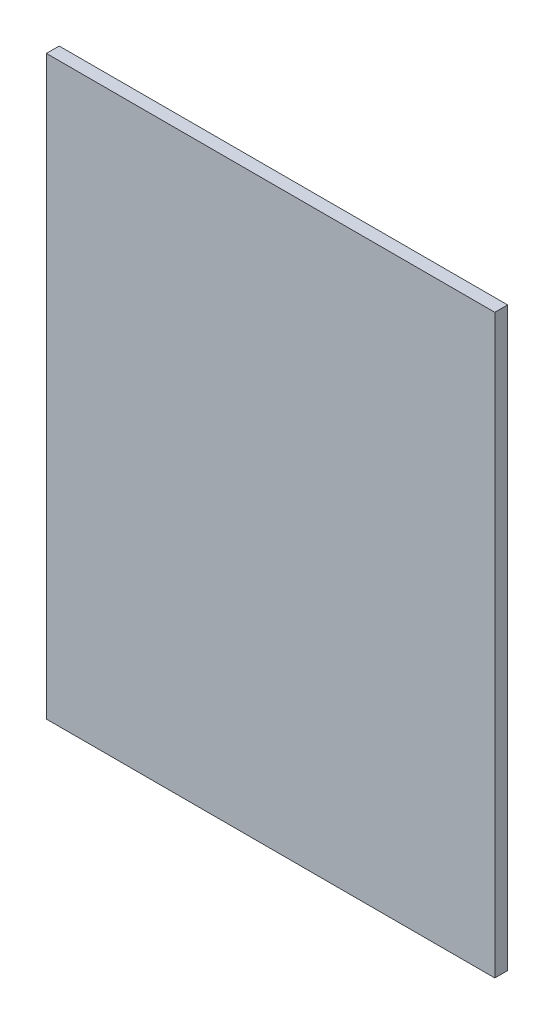
ISO-10303-21;
HEADER;
FILE_DESCRIPTION(('STEP AP214'),'2;1');
FILE_NAME('part.step','',(''),(''),'','','');
FILE_SCHEMA(('AUTOMOTIVE_DESIGN { 1 0 10303 214 1 1 1 1 }'));
ENDSEC;
DATA;
#1=APPLICATION_CONTEXT('core data for automotive mechanical design processes');
#2=APPLICATION_PROTOCOL_DEFINITION('international standard','automotive_design',2000,#1);
#3=PRODUCT_CONTEXT('',#1,'mechanical');
#4=PRODUCT('Part','Part','',(#3));
#5=PRODUCT_RELATED_PRODUCT_CATEGORY('part','',(#4));
#6=PRODUCT_DEFINITION_FORMATION('','',#4);
#7=PRODUCT_DEFINITION_CONTEXT('part definition',#1,'design');
#8=PRODUCT_DEFINITION('design','',#6,#7);
#9=PRODUCT_DEFINITION_SHAPE('','',#8);
#10=(LENGTH_UNIT() NAMED_UNIT(*) SI_UNIT(.MILLI.,.METRE.));
#11=(NAMED_UNIT(*) PLANE_ANGLE_UNIT() SI_UNIT($,.RADIAN.));
#12=(NAMED_UNIT(*) SI_UNIT($,.STERADIAN.) SOLID_ANGLE_UNIT());
#13=UNCERTAINTY_MEASURE_WITH_UNIT(LENGTH_MEASURE(1.E-05),#10,'distance_accuracy_value','');
#14=(GEOMETRIC_REPRESENTATION_CONTEXT(3) GLOBAL_UNCERTAINTY_ASSIGNED_CONTEXT((#13)) GLOBAL_UNIT_ASSIGNED_CONTEXT((#10,
#11,#12)) REPRESENTATION_CONTEXT('',''));
#15=CARTESIAN_POINT('',(0.,0.,0.));
#16=DIRECTION('',(0.,0.,1.));
#17=DIRECTION('',(1.,0.,0.));
#18=AXIS2_PLACEMENT_3D('',#15,#16,#17);
#19=CARTESIAN_POINT('',(70.,-90.,4.));
#20=DIRECTION('',(-1.,0.,0.));
#21=DIRECTION('',(0.,0.,1.));
#22=AXIS2_PLACEMENT_3D('',#19,#20,#21);
#23=PLANE('',#22);
#24=DIRECTION('',(0.,1.,0.));
#25=VECTOR('',#24,1.);
#26=CARTESIAN_POINT('',(70.,-90.,0.));
#27=LINE('',#26,#25);
#28=CARTESIAN_POINT('',(70.,-90.,0.));
#29=VERTEX_POINT('',#28);
#30=CARTESIAN_POINT('',(70.,90.,0.));
#31=VERTEX_POINT('',#30);
#32=EDGE_CURVE('E109',#29,#31,#27,.T.);
#33=ORIENTED_EDGE('',*,*,#32,.T.);
#34=DIRECTION('',(0.,0.,-1.));
#35=VECTOR('',#34,1.);
#36=CARTESIAN_POINT('',(70.,90.,4.));
#37=LINE('',#36,#35);
#38=CARTESIAN_POINT('',(70.,90.,4.));
#39=VERTEX_POINT('',#38);
#40=EDGE_CURVE('E11',#39,#31,#37,.T.);
#41=ORIENTED_EDGE('',*,*,#40,.F.);
#42=DIRECTION('',(0.,1.,0.));
#43=VECTOR('',#42,1.);
#44=CARTESIAN_POINT('',(70.,-90.,4.));
#45=LINE('',#44,#43);
#46=CARTESIAN_POINT('',(70.,-90.,4.));
#47=VERTEX_POINT('',#46);
#48=EDGE_CURVE('E93',#47,#39,#45,.T.);
#49=ORIENTED_EDGE('',*,*,#48,.F.);
#50=DIRECTION('',(0.,0.,-1.));
#51=VECTOR('',#50,1.);
#52=CARTESIAN_POINT('',(70.,-90.,4.));
#53=LINE('',#52,#51);
#54=EDGE_CURVE('E105',#47,#29,#53,.T.);
#55=ORIENTED_EDGE('',*,*,#54,.T.);
#56=EDGE_LOOP('',(#33,#41,#49,#55));
#57=FACE_BOUND('',#56,.T.);
#58=ADVANCED_FACE('F41',(#57),#23,.F.);
#59=CARTESIAN_POINT('',(-70.,90.,4.));
#60=DIRECTION('',(0.,-1.,0.));
#61=DIRECTION('',(0.,0.,-1.));
#62=AXIS2_PLACEMENT_3D('',#59,#60,#61);
#63=PLANE('',#62);
#64=DIRECTION('',(-1.,0.,0.));
#65=VECTOR('',#64,1.);
#66=CARTESIAN_POINT('',(-70.,90.,0.));
#67=LINE('',#66,#65);
#68=CARTESIAN_POINT('',(-70.,90.,0.));
#69=VERTEX_POINT('',#68);
#70=EDGE_CURVE('E98',#31,#69,#67,.T.);
#71=ORIENTED_EDGE('',*,*,#70,.T.);
#72=DIRECTION('',(0.,0.,-1.));
#73=VECTOR('',#72,1.);
#74=CARTESIAN_POINT('',(-70.,90.,4.));
#75=LINE('',#74,#73);
#76=CARTESIAN_POINT('',(-70.,90.,4.));
#77=VERTEX_POINT('',#76);
#78=EDGE_CURVE('E50',#77,#69,#75,.T.);
#79=ORIENTED_EDGE('',*,*,#78,.F.);
#80=DIRECTION('',(-1.,0.,0.));
#81=VECTOR('',#80,1.);
#82=CARTESIAN_POINT('',(-70.,90.,4.));
#83=LINE('',#82,#81);
#84=EDGE_CURVE('E88',#39,#77,#83,.T.);
#85=ORIENTED_EDGE('',*,*,#84,.F.);
#86=ORIENTED_EDGE('',*,*,#40,.T.);
#87=EDGE_LOOP('',(#71,#79,#85,#86));
#88=FACE_BOUND('',#87,.T.);
#89=ADVANCED_FACE('F97',(#88),#63,.F.);
#90=CARTESIAN_POINT('',(-70.,-90.,4.));
#91=DIRECTION('',(1.,0.,0.));
#92=DIRECTION('',(0.,0.,-1.));
#93=AXIS2_PLACEMENT_3D('',#90,#91,#92);
#94=PLANE('',#93);
#95=DIRECTION('',(0.,-1.,0.));
#96=VECTOR('',#95,1.);
#97=CARTESIAN_POINT('',(-70.,-90.,0.));
#98=LINE('',#97,#96);
#99=CARTESIAN_POINT('',(-70.,-90.,0.));
#100=VERTEX_POINT('',#99);
#101=EDGE_CURVE('E75',#69,#100,#98,.T.);
#102=ORIENTED_EDGE('',*,*,#101,.T.);
#103=DIRECTION('',(0.,0.,-1.));
#104=VECTOR('',#103,1.);
#105=CARTESIAN_POINT('',(-70.,-90.,4.));
#106=LINE('',#105,#104);
#107=CARTESIAN_POINT('',(-70.,-90.,4.));
#108=VERTEX_POINT('',#107);
#109=EDGE_CURVE('E100',#108,#100,#106,.T.);
#110=ORIENTED_EDGE('',*,*,#109,.F.);
#111=DIRECTION('',(0.,-1.,0.));
#112=VECTOR('',#111,1.);
#113=CARTESIAN_POINT('',(-70.,-90.,4.));
#114=LINE('',#113,#112);
#115=EDGE_CURVE('E91',#77,#108,#114,.T.);
#116=ORIENTED_EDGE('',*,*,#115,.F.);
#117=ORIENTED_EDGE('',*,*,#78,.T.);
#118=EDGE_LOOP('',(#102,#110,#116,#117));
#119=FACE_BOUND('',#118,.T.);
#120=ADVANCED_FACE('F101',(#119),#94,.F.);
#121=CARTESIAN_POINT('',(-70.,-90.,4.));
#122=DIRECTION('',(0.,1.,0.));
#123=DIRECTION('',(0.,0.,1.));
#124=AXIS2_PLACEMENT_3D('',#121,#122,#123);
#125=PLANE('',#124);
#126=DIRECTION('',(1.,0.,0.));
#127=VECTOR('',#126,1.);
#128=CARTESIAN_POINT('',(-70.,-90.,0.));
#129=LINE('',#128,#127);
#130=EDGE_CURVE('E81',#100,#29,#129,.T.);
#131=ORIENTED_EDGE('',*,*,#130,.T.);
#132=ORIENTED_EDGE('',*,*,#54,.F.);
#133=DIRECTION('',(1.,0.,0.));
#134=VECTOR('',#133,1.);
#135=CARTESIAN_POINT('',(-70.,-90.,4.));
#136=LINE('',#135,#134);
#137=EDGE_CURVE('E58',#108,#47,#136,.T.);
#138=ORIENTED_EDGE('',*,*,#137,.F.);
#139=ORIENTED_EDGE('',*,*,#109,.T.);
#140=EDGE_LOOP('',(#131,#132,#138,#139));
#141=FACE_BOUND('',#140,.T.);
#142=ADVANCED_FACE('F122',(#141),#125,.F.);
#143=CARTESIAN_POINT('',(0.,0.,4.));
#144=DIRECTION('',(0.,0.,-1.));
#145=DIRECTION('',(-1.,0.,0.));
#146=AXIS2_PLACEMENT_3D('',#143,#144,#145);
#147=PLANE('',#146);
#148=ORIENTED_EDGE('',*,*,#48,.T.);
#149=ORIENTED_EDGE('',*,*,#84,.T.);
#150=ORIENTED_EDGE('',*,*,#115,.T.);
#151=ORIENTED_EDGE('',*,*,#137,.T.);
#152=EDGE_LOOP('',(#148,#149,#150,#151));
#153=FACE_BOUND('',#152,.T.);
#154=ADVANCED_FACE('F89',(#153),#147,.F.);
#155=CARTESIAN_POINT('',(0.,0.,0.));
#156=DIRECTION('',(0.,0.,-1.));
#157=DIRECTION('',(-1.,0.,0.));
#158=AXIS2_PLACEMENT_3D('',#155,#156,#157);
#159=PLANE('',#158);
#160=ORIENTED_EDGE('',*,*,#32,.F.);
#161=ORIENTED_EDGE('',*,*,#130,.F.);
#162=ORIENTED_EDGE('',*,*,#101,.F.);
#163=ORIENTED_EDGE('',*,*,#70,.F.);
#164=EDGE_LOOP('',(#160,#161,#162,#163));
#165=FACE_BOUND('',#164,.T.);
#166=ADVANCED_FACE('F125',(#165),#159,.T.);
#167=CLOSED_SHELL('',(#58,#89,#120,#142,#154,#166));
#168=MANIFOLD_SOLID_BREP('B2',#167);
#169=ADVANCED_BREP_SHAPE_REPRESENTATION('',(#18,#168),#14);
#170=SHAPE_DEFINITION_REPRESENTATION(#9,#169);
ENDSEC;
END-ISO-10303-21;
